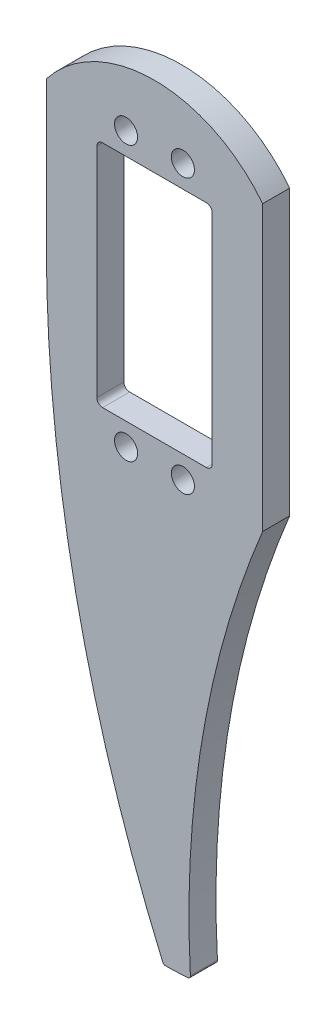
ISO-10303-21;
HEADER;
FILE_DESCRIPTION(('STEP AP214'),'2;1');
FILE_NAME('part.step','',(''),(''),'','','');
FILE_SCHEMA(('AUTOMOTIVE_DESIGN { 1 0 10303 214 1 1 1 1 }'));
ENDSEC;
DATA;
#1=APPLICATION_CONTEXT('core data for automotive mechanical design processes');
#2=APPLICATION_PROTOCOL_DEFINITION('international standard','automotive_design',2000,#1);
#3=PRODUCT_CONTEXT('',#1,'mechanical');
#4=PRODUCT('Part','Part','',(#3));
#5=PRODUCT_RELATED_PRODUCT_CATEGORY('part','',(#4));
#6=PRODUCT_DEFINITION_FORMATION('','',#4);
#7=PRODUCT_DEFINITION_CONTEXT('part definition',#1,'design');
#8=PRODUCT_DEFINITION('design','',#6,#7);
#9=PRODUCT_DEFINITION_SHAPE('','',#8);
#10=(LENGTH_UNIT() NAMED_UNIT(*) SI_UNIT(.MILLI.,.METRE.));
#11=(NAMED_UNIT(*) PLANE_ANGLE_UNIT() SI_UNIT($,.RADIAN.));
#12=(NAMED_UNIT(*) SI_UNIT($,.STERADIAN.) SOLID_ANGLE_UNIT());
#13=UNCERTAINTY_MEASURE_WITH_UNIT(LENGTH_MEASURE(1.E-05),#10,'distance_accuracy_value','');
#14=(GEOMETRIC_REPRESENTATION_CONTEXT(3) GLOBAL_UNCERTAINTY_ASSIGNED_CONTEXT((#13)) GLOBAL_UNIT_ASSIGNED_CONTEXT((#10,
#11,#12)) REPRESENTATION_CONTEXT('',''));
#15=CARTESIAN_POINT('',(0.,0.,0.));
#16=DIRECTION('',(0.,0.,1.));
#17=DIRECTION('',(1.,0.,0.));
#18=AXIS2_PLACEMENT_3D('',#15,#16,#17);
#19=CARTESIAN_POINT('',(-19.05,-14.8106178129071,4.7625));
#20=DIRECTION('',(0.,0.,1.));
#21=DIRECTION('',(1.,0.,0.));
#22=AXIS2_PLACEMENT_3D('',#19,#20,#21);
#23=PLANE('',#22);
#24=CARTESIAN_POINT('',(-24.0538,-49.1260178129071,4.7625));
#25=DIRECTION('',(0.,0.,1.));
#26=DIRECTION('',(1.,0.,0.));
#27=AXIS2_PLACEMENT_3D('',#24,#25,#26);
#28=CIRCLE('',#27,2.032);
#29=CARTESIAN_POINT('',(-26.0858,-49.1260178129071,4.7625));
#30=VERTEX_POINT('',#29);
#31=EDGE_CURVE('E298',#30,#30,#28,.T.);
#32=ORIENTED_EDGE('',*,*,#31,.F.);
#33=EDGE_LOOP('',(#32));
#34=FACE_BOUND('',#33,.T.);
#35=CARTESIAN_POINT('',(-14.0462,-0.866017812907058,4.7625));
#36=DIRECTION('',(0.,0.,1.));
#37=DIRECTION('',(1.,0.,0.));
#38=AXIS2_PLACEMENT_3D('',#35,#36,#37);
#39=CIRCLE('',#38,2.032);
#40=CARTESIAN_POINT('',(-16.0782,-0.866017812907058,4.7625));
#41=VERTEX_POINT('',#40);
#42=EDGE_CURVE('E280',#41,#41,#39,.T.);
#43=ORIENTED_EDGE('',*,*,#42,.F.);
#44=EDGE_LOOP('',(#43));
#45=FACE_BOUND('',#44,.T.);
#46=CARTESIAN_POINT('',(-19.05,-14.8106178129071,4.7625));
#47=DIRECTION('',(0.,0.,1.));
#48=DIRECTION('',(1.,0.,0.));
#49=AXIS2_PLACEMENT_3D('',#46,#47,#48);
#50=CIRCLE('',#49,110.);
#51=CARTESIAN_POINT('',(-17.1186626868823,-124.793661670508,4.7625));
#52=VERTEX_POINT('',#51);
#53=CARTESIAN_POINT('',(-13.2088056396765,-124.655419457978,4.7625));
#54=VERTEX_POINT('',#53);
#55=EDGE_CURVE('E229',#52,#54,#50,.T.);
#56=ORIENTED_EDGE('',*,*,#55,.T.);
#57=CARTESIAN_POINT('',(-13.2357813372678,-124.148136192199,4.7625));
#58=DIRECTION('',(0.,0.,1.));
#59=DIRECTION('',(1.,0.,0.));
#60=AXIS2_PLACEMENT_3D('',#57,#58,#59);
#61=CIRCLE('',#60,0.508);
#62=CARTESIAN_POINT('',(-12.7285425364788,-124.120336930084,4.7625));
#63=VERTEX_POINT('',#62);
#64=EDGE_CURVE('E41',#54,#63,#61,.T.);
#65=ORIENTED_EDGE('',*,*,#64,.T.);
#66=CARTESIAN_POINT('',(155.723912747509,-114.888286954809,4.7625));
#67=DIRECTION('',(0.,0.,-1.));
#68=DIRECTION('',(-1.,0.,0.));
#69=AXIS2_PLACEMENT_3D('',#66,#67,#68);
#70=CIRCLE('',#69,168.705247215224);
#71=CARTESIAN_POINT('',(0.,-49.9920356258141,4.7625));
#72=VERTEX_POINT('',#71);
#73=EDGE_CURVE('E227',#63,#72,#70,.T.);
#74=ORIENTED_EDGE('',*,*,#73,.T.);
#75=DIRECTION('',(0.,1.,0.));
#76=VECTOR('',#75,1.);
#77=CARTESIAN_POINT('',(0.,-49.9920356258141,4.7625));
#78=LINE('',#77,#76);
#79=CARTESIAN_POINT('',(0.,0.,4.7625));
#80=VERTEX_POINT('',#79);
#81=EDGE_CURVE('E163',#72,#80,#78,.T.);
#82=ORIENTED_EDGE('',*,*,#81,.T.);
#83=CARTESIAN_POINT('',(-19.05,-14.8106178129071,4.7625));
#84=DIRECTION('',(0.,0.,1.));
#85=DIRECTION('',(1.,0.,0.));
#86=AXIS2_PLACEMENT_3D('',#83,#84,#85);
#87=CIRCLE('',#86,24.13);
#88=CARTESIAN_POINT('',(-38.1,0.,4.7625));
#89=VERTEX_POINT('',#88);
#90=EDGE_CURVE('E158',#80,#89,#87,.T.);
#91=ORIENTED_EDGE('',*,*,#90,.T.);
#92=DIRECTION('',(0.,-1.,0.));
#93=VECTOR('',#92,1.);
#94=CARTESIAN_POINT('',(-38.1,0.,4.7625));
#95=LINE('',#94,#93);
#96=CARTESIAN_POINT('',(-38.1000000000001,-24.996017812907,4.7625));
#97=VERTEX_POINT('',#96);
#98=EDGE_CURVE('E148',#89,#97,#95,.T.);
#99=ORIENTED_EDGE('',*,*,#98,.T.);
#100=CARTESIAN_POINT('',(213.508258755887,-24.9960178129071,4.7625));
#101=DIRECTION('',(0.,0.,1.));
#102=DIRECTION('',(1.,0.,0.));
#103=AXIS2_PLACEMENT_3D('',#100,#101,#102);
#104=CIRCLE('',#103,251.608258755887);
#105=CARTESIAN_POINT('',(-17.5941804656756,-124.486612644848,4.7625));
#106=VERTEX_POINT('',#105);
#107=EDGE_CURVE('E157',#97,#106,#104,.T.);
#108=ORIENTED_EDGE('',*,*,#107,.T.);
#109=CARTESIAN_POINT('',(-17.1275819537465,-124.285739977056,4.7625));
#110=DIRECTION('',(0.,0.,1.));
#111=DIRECTION('',(1.,0.,0.));
#112=AXIS2_PLACEMENT_3D('',#109,#110,#111);
#113=CIRCLE('',#112,0.508);
#114=EDGE_CURVE('E224',#106,#52,#113,.T.);
#115=ORIENTED_EDGE('',*,*,#114,.T.);
#116=EDGE_LOOP('',(#56,#65,#74,#82,#91,#99,#108,#115));
#117=FACE_BOUND('',#116,.T.);
#118=DIRECTION('',(-1.,0.,0.));
#119=VECTOR('',#118,1.);
#120=CARTESIAN_POINT('',(-29.21,-4.80301781290706,4.7625));
#121=LINE('',#120,#119);
#122=CARTESIAN_POINT('',(-9.90600000000001,-4.80301781290706,4.7625));
#123=VERTEX_POINT('',#122);
#124=CARTESIAN_POINT('',(-28.194,-4.80301781290706,4.7625));
#125=VERTEX_POINT('',#124);
#126=EDGE_CURVE('E284',#123,#125,#121,.T.);
#127=ORIENTED_EDGE('',*,*,#126,.F.);
#128=CARTESIAN_POINT('',(-9.90600000000001,-5.81901781290706,4.7625));
#129=DIRECTION('',(0.,0.,1.));
#130=DIRECTION('',(1.,0.,0.));
#131=AXIS2_PLACEMENT_3D('',#128,#129,#130);
#132=CIRCLE('',#131,1.016);
#133=CARTESIAN_POINT('',(-8.89000000000001,-5.81901781290706,4.7625));
#134=VERTEX_POINT('',#133);
#135=EDGE_CURVE('E211',#123,#134,#132,.F.);
#136=ORIENTED_EDGE('',*,*,#135,.T.);
#137=DIRECTION('',(0.,1.,0.));
#138=VECTOR('',#137,1.);
#139=CARTESIAN_POINT('',(-8.89000000000001,-4.80301781290706,4.7625));
#140=LINE('',#139,#138);
#141=CARTESIAN_POINT('',(-8.89000000000001,-44.173017812907,4.7625));
#142=VERTEX_POINT('',#141);
#143=EDGE_CURVE('E271',#142,#134,#140,.T.);
#144=ORIENTED_EDGE('',*,*,#143,.F.);
#145=CARTESIAN_POINT('',(-9.90600000000001,-44.1730178129071,4.7625));
#146=DIRECTION('',(0.,0.,1.));
#147=DIRECTION('',(1.,0.,0.));
#148=AXIS2_PLACEMENT_3D('',#145,#146,#147);
#149=CIRCLE('',#148,1.016);
#150=CARTESIAN_POINT('',(-9.90600000000001,-45.1890178129071,4.7625));
#151=VERTEX_POINT('',#150);
#152=EDGE_CURVE('E203',#142,#151,#149,.F.);
#153=ORIENTED_EDGE('',*,*,#152,.T.);
#154=DIRECTION('',(1.,0.,0.));
#155=VECTOR('',#154,1.);
#156=CARTESIAN_POINT('',(-29.21,-45.1890178129071,4.7625));
#157=LINE('',#156,#155);
#158=CARTESIAN_POINT('',(-28.194,-45.1890178129071,4.7625));
#159=VERTEX_POINT('',#158);
#160=EDGE_CURVE('E259',#159,#151,#157,.T.);
#161=ORIENTED_EDGE('',*,*,#160,.F.);
#162=CARTESIAN_POINT('',(-28.194,-44.1730178129071,4.7625));
#163=DIRECTION('',(0.,0.,1.));
#164=DIRECTION('',(1.,0.,0.));
#165=AXIS2_PLACEMENT_3D('',#162,#163,#164);
#166=CIRCLE('',#165,1.016);
#167=CARTESIAN_POINT('',(-29.21,-44.173017812907,4.7625));
#168=VERTEX_POINT('',#167);
#169=EDGE_CURVE('E199',#159,#168,#166,.F.);
#170=ORIENTED_EDGE('',*,*,#169,.T.);
#171=DIRECTION('',(0.,-1.,0.));
#172=VECTOR('',#171,1.);
#173=CARTESIAN_POINT('',(-29.21,-4.80301781290706,4.7625));
#174=LINE('',#173,#172);
#175=CARTESIAN_POINT('',(-29.21,-5.81901781290706,4.7625));
#176=VERTEX_POINT('',#175);
#177=EDGE_CURVE('E262',#176,#168,#174,.T.);
#178=ORIENTED_EDGE('',*,*,#177,.F.);
#179=CARTESIAN_POINT('',(-28.194,-5.81901781290706,4.7625));
#180=DIRECTION('',(0.,0.,1.));
#181=DIRECTION('',(1.,0.,0.));
#182=AXIS2_PLACEMENT_3D('',#179,#180,#181);
#183=CIRCLE('',#182,1.016);
#184=EDGE_CURVE('E207',#176,#125,#183,.F.);
#185=ORIENTED_EDGE('',*,*,#184,.T.);
#186=EDGE_LOOP('',(#127,#136,#144,#153,#161,#170,#178,#185));
#187=FACE_BOUND('',#186,.T.);
#188=CARTESIAN_POINT('',(-24.0538,-0.866017812907058,4.7625));
#189=DIRECTION('',(0.,0.,1.));
#190=DIRECTION('',(-1.,0.,0.));
#191=AXIS2_PLACEMENT_3D('',#188,#189,#190);
#192=CIRCLE('',#191,2.032);
#193=CARTESIAN_POINT('',(-26.0858,-0.866017812907058,4.7625));
#194=VERTEX_POINT('',#193);
#195=EDGE_CURVE('E292',#194,#194,#192,.T.);
#196=ORIENTED_EDGE('',*,*,#195,.F.);
#197=EDGE_LOOP('',(#196));
#198=FACE_BOUND('',#197,.T.);
#199=CARTESIAN_POINT('',(-14.0462,-49.1260178129071,4.7625));
#200=DIRECTION('',(0.,0.,1.));
#201=DIRECTION('',(-1.,0.,0.));
#202=AXIS2_PLACEMENT_3D('',#199,#200,#201);
#203=CIRCLE('',#202,2.032);
#204=CARTESIAN_POINT('',(-16.0782,-49.1260178129071,4.7625));
#205=VERTEX_POINT('',#204);
#206=EDGE_CURVE('E304',#205,#205,#203,.T.);
#207=ORIENTED_EDGE('',*,*,#206,.F.);
#208=EDGE_LOOP('',(#207));
#209=FACE_BOUND('',#208,.T.);
#210=ADVANCED_FACE('F33',(#34,#45,#117,#187,#198,#209),#23,.T.);
#211=CARTESIAN_POINT('',(-19.05,-14.8106178129071,0.));
#212=DIRECTION('',(0.,0.,1.));
#213=DIRECTION('',(1.,0.,0.));
#214=AXIS2_PLACEMENT_3D('',#211,#212,#213);
#215=PLANE('',#214);
#216=CARTESIAN_POINT('',(-24.0538,-49.1260178129071,0.));
#217=DIRECTION('',(0.,0.,1.));
#218=DIRECTION('',(1.,0.,0.));
#219=AXIS2_PLACEMENT_3D('',#216,#217,#218);
#220=CIRCLE('',#219,2.032);
#221=CARTESIAN_POINT('',(-26.0858,-49.1260178129071,0.));
#222=VERTEX_POINT('',#221);
#223=EDGE_CURVE('E301',#222,#222,#220,.T.);
#224=ORIENTED_EDGE('',*,*,#223,.T.);
#225=EDGE_LOOP('',(#224));
#226=FACE_BOUND('',#225,.T.);
#227=CARTESIAN_POINT('',(-14.0462,-0.866017812907058,0.));
#228=DIRECTION('',(0.,0.,1.));
#229=DIRECTION('',(1.,0.,0.));
#230=AXIS2_PLACEMENT_3D('',#227,#228,#229);
#231=CIRCLE('',#230,2.032);
#232=CARTESIAN_POINT('',(-16.0782,-0.866017812907058,0.));
#233=VERTEX_POINT('',#232);
#234=EDGE_CURVE('E289',#233,#233,#231,.T.);
#235=ORIENTED_EDGE('',*,*,#234,.T.);
#236=EDGE_LOOP('',(#235));
#237=FACE_BOUND('',#236,.T.);
#238=CARTESIAN_POINT('',(155.723912747509,-114.888286954809,0.));
#239=DIRECTION('',(0.,0.,-1.));
#240=DIRECTION('',(-1.,0.,0.));
#241=AXIS2_PLACEMENT_3D('',#238,#239,#240);
#242=CIRCLE('',#241,168.705247215224);
#243=CARTESIAN_POINT('',(-12.7285425364788,-124.120336930084,0.));
#244=VERTEX_POINT('',#243);
#245=CARTESIAN_POINT('',(0.,-49.9920356258141,0.));
#246=VERTEX_POINT('',#245);
#247=EDGE_CURVE('E244',#244,#246,#242,.T.);
#248=ORIENTED_EDGE('',*,*,#247,.F.);
#249=CARTESIAN_POINT('',(-13.2357813372678,-124.148136192199,0.));
#250=DIRECTION('',(0.,0.,1.));
#251=DIRECTION('',(1.,0.,0.));
#252=AXIS2_PLACEMENT_3D('',#249,#250,#251);
#253=CIRCLE('',#252,0.508);
#254=CARTESIAN_POINT('',(-13.2088056396765,-124.655419457978,0.));
#255=VERTEX_POINT('',#254);
#256=EDGE_CURVE('E218',#244,#255,#253,.F.);
#257=ORIENTED_EDGE('',*,*,#256,.T.);
#258=CARTESIAN_POINT('',(-19.05,-14.8106178129071,0.));
#259=DIRECTION('',(0.,0.,1.));
#260=DIRECTION('',(1.,0.,0.));
#261=AXIS2_PLACEMENT_3D('',#258,#259,#260);
#262=CIRCLE('',#261,110.);
#263=CARTESIAN_POINT('',(-17.1186626868823,-124.793661670508,0.));
#264=VERTEX_POINT('',#263);
#265=EDGE_CURVE('E242',#264,#255,#262,.T.);
#266=ORIENTED_EDGE('',*,*,#265,.F.);
#267=CARTESIAN_POINT('',(-17.1275819537465,-124.285739977056,0.));
#268=DIRECTION('',(0.,0.,1.));
#269=DIRECTION('',(1.,0.,0.));
#270=AXIS2_PLACEMENT_3D('',#267,#268,#269);
#271=CIRCLE('',#270,0.508);
#272=CARTESIAN_POINT('',(-17.5941804656756,-124.486612644848,0.));
#273=VERTEX_POINT('',#272);
#274=EDGE_CURVE('E216',#264,#273,#271,.F.);
#275=ORIENTED_EDGE('',*,*,#274,.T.);
#276=CARTESIAN_POINT('',(213.508258755887,-24.9960178129071,0.));
#277=DIRECTION('',(0.,0.,1.));
#278=DIRECTION('',(1.,0.,0.));
#279=AXIS2_PLACEMENT_3D('',#276,#277,#278);
#280=CIRCLE('',#279,251.608258755887);
#281=CARTESIAN_POINT('',(-38.1000000000001,-24.996017812907,0.));
#282=VERTEX_POINT('',#281);
#283=EDGE_CURVE('E247',#282,#273,#280,.T.);
#284=ORIENTED_EDGE('',*,*,#283,.F.);
#285=DIRECTION('',(0.,-1.,0.));
#286=VECTOR('',#285,1.);
#287=CARTESIAN_POINT('',(-38.1,0.,0.));
#288=LINE('',#287,#286);
#289=CARTESIAN_POINT('',(-38.1,0.,0.));
#290=VERTEX_POINT('',#289);
#291=EDGE_CURVE('E250',#290,#282,#288,.T.);
#292=ORIENTED_EDGE('',*,*,#291,.F.);
#293=CARTESIAN_POINT('',(-19.05,-14.8106178129071,0.));
#294=DIRECTION('',(0.,0.,1.));
#295=DIRECTION('',(1.,0.,0.));
#296=AXIS2_PLACEMENT_3D('',#293,#294,#295);
#297=CIRCLE('',#296,24.13);
#298=CARTESIAN_POINT('',(0.,0.,0.));
#299=VERTEX_POINT('',#298);
#300=EDGE_CURVE('E171',#299,#290,#297,.T.);
#301=ORIENTED_EDGE('',*,*,#300,.F.);
#302=DIRECTION('',(0.,1.,0.));
#303=VECTOR('',#302,1.);
#304=CARTESIAN_POINT('',(0.,-49.9920356258141,0.));
#305=LINE('',#304,#303);
#306=EDGE_CURVE('E167',#246,#299,#305,.T.);
#307=ORIENTED_EDGE('',*,*,#306,.F.);
#308=EDGE_LOOP('',(#248,#257,#266,#275,#284,#292,#301,#307));
#309=FACE_BOUND('',#308,.T.);
#310=DIRECTION('',(1.,0.,0.));
#311=VECTOR('',#310,1.);
#312=CARTESIAN_POINT('',(-29.21,-45.1890178129071,0.));
#313=LINE('',#312,#311);
#314=CARTESIAN_POINT('',(-28.194,-45.1890178129071,0.));
#315=VERTEX_POINT('',#314);
#316=CARTESIAN_POINT('',(-9.90600000000001,-45.1890178129071,0.));
#317=VERTEX_POINT('',#316);
#318=EDGE_CURVE('E268',#315,#317,#313,.T.);
#319=ORIENTED_EDGE('',*,*,#318,.T.);
#320=CARTESIAN_POINT('',(-9.90600000000001,-44.1730178129071,0.));
#321=DIRECTION('',(0.,0.,1.));
#322=DIRECTION('',(1.,0.,0.));
#323=AXIS2_PLACEMENT_3D('',#320,#321,#322);
#324=CIRCLE('',#323,1.016);
#325=CARTESIAN_POINT('',(-8.89000000000001,-44.173017812907,0.));
#326=VERTEX_POINT('',#325);
#327=EDGE_CURVE('E201',#317,#326,#324,.T.);
#328=ORIENTED_EDGE('',*,*,#327,.T.);
#329=DIRECTION('',(0.,1.,0.));
#330=VECTOR('',#329,1.);
#331=CARTESIAN_POINT('',(-8.89000000000001,-4.80301781290706,0.));
#332=LINE('',#331,#330);
#333=CARTESIAN_POINT('',(-8.89000000000001,-5.81901781290706,0.));
#334=VERTEX_POINT('',#333);
#335=EDGE_CURVE('E278',#326,#334,#332,.T.);
#336=ORIENTED_EDGE('',*,*,#335,.T.);
#337=CARTESIAN_POINT('',(-9.90600000000001,-5.81901781290706,0.));
#338=DIRECTION('',(0.,0.,1.));
#339=DIRECTION('',(1.,0.,0.));
#340=AXIS2_PLACEMENT_3D('',#337,#338,#339);
#341=CIRCLE('',#340,1.016);
#342=CARTESIAN_POINT('',(-9.90600000000001,-4.80301781290706,0.));
#343=VERTEX_POINT('',#342);
#344=EDGE_CURVE('E209',#334,#343,#341,.T.);
#345=ORIENTED_EDGE('',*,*,#344,.T.);
#346=DIRECTION('',(-1.,0.,0.));
#347=VECTOR('',#346,1.);
#348=CARTESIAN_POINT('',(-29.21,-4.80301781290706,0.));
#349=LINE('',#348,#347);
#350=CARTESIAN_POINT('',(-28.194,-4.80301781290706,0.));
#351=VERTEX_POINT('',#350);
#352=EDGE_CURVE('E275',#343,#351,#349,.T.);
#353=ORIENTED_EDGE('',*,*,#352,.T.);
#354=CARTESIAN_POINT('',(-28.194,-5.81901781290706,0.));
#355=DIRECTION('',(0.,0.,1.));
#356=DIRECTION('',(1.,0.,0.));
#357=AXIS2_PLACEMENT_3D('',#354,#355,#356);
#358=CIRCLE('',#357,1.016);
#359=CARTESIAN_POINT('',(-29.21,-5.81901781290706,0.));
#360=VERTEX_POINT('',#359);
#361=EDGE_CURVE('E205',#351,#360,#358,.T.);
#362=ORIENTED_EDGE('',*,*,#361,.T.);
#363=DIRECTION('',(0.,-1.,0.));
#364=VECTOR('',#363,1.);
#365=CARTESIAN_POINT('',(-29.21,-4.80301781290706,0.));
#366=LINE('',#365,#364);
#367=CARTESIAN_POINT('',(-29.21,-44.173017812907,0.));
#368=VERTEX_POINT('',#367);
#369=EDGE_CURVE('E272',#360,#368,#366,.T.);
#370=ORIENTED_EDGE('',*,*,#369,.T.);
#371=CARTESIAN_POINT('',(-28.194,-44.1730178129071,0.));
#372=DIRECTION('',(0.,0.,1.));
#373=DIRECTION('',(1.,0.,0.));
#374=AXIS2_PLACEMENT_3D('',#371,#372,#373);
#375=CIRCLE('',#374,1.016);
#376=EDGE_CURVE('E197',#368,#315,#375,.T.);
#377=ORIENTED_EDGE('',*,*,#376,.T.);
#378=EDGE_LOOP('',(#319,#328,#336,#345,#353,#362,#370,#377));
#379=FACE_BOUND('',#378,.T.);
#380=CARTESIAN_POINT('',(-24.0538,-0.866017812907058,0.));
#381=DIRECTION('',(0.,0.,1.));
#382=DIRECTION('',(-1.,0.,0.));
#383=AXIS2_PLACEMENT_3D('',#380,#381,#382);
#384=CIRCLE('',#383,2.032);
#385=CARTESIAN_POINT('',(-26.0858,-0.866017812907058,0.));
#386=VERTEX_POINT('',#385);
#387=EDGE_CURVE('E295',#386,#386,#384,.T.);
#388=ORIENTED_EDGE('',*,*,#387,.T.);
#389=EDGE_LOOP('',(#388));
#390=FACE_BOUND('',#389,.T.);
#391=CARTESIAN_POINT('',(-14.0462,-49.1260178129071,0.));
#392=DIRECTION('',(0.,0.,1.));
#393=DIRECTION('',(-1.,0.,0.));
#394=AXIS2_PLACEMENT_3D('',#391,#392,#393);
#395=CIRCLE('',#394,2.032);
#396=CARTESIAN_POINT('',(-16.0782,-49.1260178129071,0.));
#397=VERTEX_POINT('',#396);
#398=EDGE_CURVE('E307',#397,#397,#395,.T.);
#399=ORIENTED_EDGE('',*,*,#398,.T.);
#400=EDGE_LOOP('',(#399));
#401=FACE_BOUND('',#400,.T.);
#402=ADVANCED_FACE('F240',(#226,#237,#309,#379,#390,#401),#215,.F.);
#403=CARTESIAN_POINT('',(-19.05,-14.8106178129071,4.7625));
#404=DIRECTION('',(0.,0.,-1.));
#405=DIRECTION('',(-1.,0.,0.));
#406=AXIS2_PLACEMENT_3D('',#403,#404,#405);
#407=CYLINDRICAL_SURFACE('',#406,24.13);
#408=ORIENTED_EDGE('',*,*,#300,.T.);
#409=DIRECTION('',(0.,0.,-1.));
#410=VECTOR('',#409,1.);
#411=CARTESIAN_POINT('',(-38.1,0.,4.7625));
#412=LINE('',#411,#410);
#413=EDGE_CURVE('E152',#89,#290,#412,.T.);
#414=ORIENTED_EDGE('',*,*,#413,.F.);
#415=ORIENTED_EDGE('',*,*,#90,.F.);
#416=DIRECTION('',(0.,0.,-1.));
#417=VECTOR('',#416,1.);
#418=CARTESIAN_POINT('',(0.,0.,4.7625));
#419=LINE('',#418,#417);
#420=EDGE_CURVE('E255',#80,#299,#419,.T.);
#421=ORIENTED_EDGE('',*,*,#420,.T.);
#422=EDGE_LOOP('',(#408,#414,#415,#421));
#423=FACE_BOUND('',#422,.T.);
#424=ADVANCED_FACE('F169',(#423),#407,.T.);
#425=CARTESIAN_POINT('',(-38.1,0.,4.7625));
#426=DIRECTION('',(1.,0.,0.));
#427=DIRECTION('',(0.,1.,0.));
#428=AXIS2_PLACEMENT_3D('',#425,#426,#427);
#429=PLANE('',#428);
#430=ORIENTED_EDGE('',*,*,#291,.T.);
#431=DIRECTION('',(0.,0.,-1.));
#432=VECTOR('',#431,1.);
#433=CARTESIAN_POINT('',(-38.1000000000001,-24.996017812907,4.7625));
#434=LINE('',#433,#432);
#435=EDGE_CURVE('E155',#97,#282,#434,.T.);
#436=ORIENTED_EDGE('',*,*,#435,.F.);
#437=ORIENTED_EDGE('',*,*,#98,.F.);
#438=ORIENTED_EDGE('',*,*,#413,.T.);
#439=EDGE_LOOP('',(#430,#436,#437,#438));
#440=FACE_BOUND('',#439,.T.);
#441=ADVANCED_FACE('F150',(#440),#429,.F.);
#442=CARTESIAN_POINT('',(213.508258755887,-24.9960178129071,4.7625));
#443=DIRECTION('',(0.,0.,-1.));
#444=DIRECTION('',(-1.,0.,0.));
#445=AXIS2_PLACEMENT_3D('',#442,#443,#444);
#446=CYLINDRICAL_SURFACE('',#445,251.608258755887);
#447=ORIENTED_EDGE('',*,*,#283,.T.);
#448=DIRECTION('',(0.,0.,-1.));
#449=VECTOR('',#448,1.);
#450=CARTESIAN_POINT('',(-17.5941804656756,-124.486612644848,4.7625));
#451=LINE('',#450,#449);
#452=EDGE_CURVE('E11',#273,#106,#451,.F.);
#453=ORIENTED_EDGE('',*,*,#452,.T.);
#454=ORIENTED_EDGE('',*,*,#107,.F.);
#455=ORIENTED_EDGE('',*,*,#435,.T.);
#456=EDGE_LOOP('',(#447,#453,#454,#455));
#457=FACE_BOUND('',#456,.T.);
#458=ADVANCED_FACE('F336',(#457),#446,.T.);
#459=CARTESIAN_POINT('',(-19.05,-14.8106178129071,4.7625));
#460=DIRECTION('',(0.,0.,-1.));
#461=DIRECTION('',(-1.,0.,0.));
#462=AXIS2_PLACEMENT_3D('',#459,#460,#461);
#463=CYLINDRICAL_SURFACE('',#462,110.);
#464=ORIENTED_EDGE('',*,*,#265,.T.);
#465=DIRECTION('',(0.,0.,-1.));
#466=VECTOR('',#465,1.);
#467=CARTESIAN_POINT('',(-13.2088056396765,-124.655419457978,4.7625));
#468=LINE('',#467,#466);
#469=EDGE_CURVE('E54',#255,#54,#468,.F.);
#470=ORIENTED_EDGE('',*,*,#469,.T.);
#471=ORIENTED_EDGE('',*,*,#55,.F.);
#472=DIRECTION('',(0.,0.,-1.));
#473=VECTOR('',#472,1.);
#474=CARTESIAN_POINT('',(-17.1186626868823,-124.793661670508,4.7625));
#475=LINE('',#474,#473);
#476=EDGE_CURVE('E220',#52,#264,#475,.T.);
#477=ORIENTED_EDGE('',*,*,#476,.T.);
#478=EDGE_LOOP('',(#464,#470,#471,#477));
#479=FACE_BOUND('',#478,.T.);
#480=ADVANCED_FACE('F245',(#479),#463,.T.);
#481=CARTESIAN_POINT('',(155.723912747509,-114.888286954809,4.7625));
#482=DIRECTION('',(0.,0.,-1.));
#483=DIRECTION('',(-1.,0.,0.));
#484=AXIS2_PLACEMENT_3D('',#481,#482,#483);
#485=CYLINDRICAL_SURFACE('',#484,168.705247215224);
#486=ORIENTED_EDGE('',*,*,#73,.F.);
#487=DIRECTION('',(0.,0.,-1.));
#488=VECTOR('',#487,1.);
#489=CARTESIAN_POINT('',(-12.7285425364788,-124.120336930084,4.7625));
#490=LINE('',#489,#488);
#491=EDGE_CURVE('E213',#63,#244,#490,.T.);
#492=ORIENTED_EDGE('',*,*,#491,.T.);
#493=ORIENTED_EDGE('',*,*,#247,.T.);
#494=DIRECTION('',(0.,0.,-1.));
#495=VECTOR('',#494,1.);
#496=CARTESIAN_POINT('',(0.,-49.9920356258141,4.7625));
#497=LINE('',#496,#495);
#498=EDGE_CURVE('E176',#72,#246,#497,.T.);
#499=ORIENTED_EDGE('',*,*,#498,.F.);
#500=EDGE_LOOP('',(#486,#492,#493,#499));
#501=FACE_BOUND('',#500,.T.);
#502=ADVANCED_FACE('F233',(#501),#485,.F.);
#503=CARTESIAN_POINT('',(0.,-49.9920356258141,4.7625));
#504=DIRECTION('',(-1.,0.,0.));
#505=DIRECTION('',(0.,-1.,0.));
#506=AXIS2_PLACEMENT_3D('',#503,#504,#505);
#507=PLANE('',#506);
#508=ORIENTED_EDGE('',*,*,#306,.T.);
#509=ORIENTED_EDGE('',*,*,#420,.F.);
#510=ORIENTED_EDGE('',*,*,#81,.F.);
#511=ORIENTED_EDGE('',*,*,#498,.T.);
#512=EDGE_LOOP('',(#508,#509,#510,#511));
#513=FACE_BOUND('',#512,.T.);
#514=ADVANCED_FACE('F257',(#513),#507,.F.);
#515=CARTESIAN_POINT('',(-8.89000000000001,-4.80301781290706,4.7625));
#516=DIRECTION('',(-1.,0.,0.));
#517=DIRECTION('',(0.,0.,1.));
#518=AXIS2_PLACEMENT_3D('',#515,#516,#517);
#519=PLANE('',#518);
#520=ORIENTED_EDGE('',*,*,#335,.F.);
#521=DIRECTION('',(0.,0.,-1.));
#522=VECTOR('',#521,1.);
#523=CARTESIAN_POINT('',(-8.89000000000001,-44.1730178129071,4.7625));
#524=LINE('',#523,#522);
#525=EDGE_CURVE('E190',#326,#142,#524,.F.);
#526=ORIENTED_EDGE('',*,*,#525,.T.);
#527=ORIENTED_EDGE('',*,*,#143,.T.);
#528=DIRECTION('',(0.,0.,-1.));
#529=VECTOR('',#528,1.);
#530=CARTESIAN_POINT('',(-8.89000000000001,-5.81901781290706,0.));
#531=LINE('',#530,#529);
#532=EDGE_CURVE('E187',#134,#334,#531,.T.);
#533=ORIENTED_EDGE('',*,*,#532,.T.);
#534=EDGE_LOOP('',(#520,#526,#527,#533));
#535=FACE_BOUND('',#534,.T.);
#536=ADVANCED_FACE('F327',(#535),#519,.T.);
#537=CARTESIAN_POINT('',(-29.21,-4.80301781290706,4.7625));
#538=DIRECTION('',(0.,-1.,0.));
#539=DIRECTION('',(0.,0.,-1.));
#540=AXIS2_PLACEMENT_3D('',#537,#538,#539);
#541=PLANE('',#540);
#542=ORIENTED_EDGE('',*,*,#126,.T.);
#543=DIRECTION('',(0.,0.,-1.));
#544=VECTOR('',#543,1.);
#545=CARTESIAN_POINT('',(-28.194,-4.80301781290706,0.));
#546=LINE('',#545,#544);
#547=EDGE_CURVE('E194',#125,#351,#546,.T.);
#548=ORIENTED_EDGE('',*,*,#547,.T.);
#549=ORIENTED_EDGE('',*,*,#352,.F.);
#550=DIRECTION('',(0.,0.,-1.));
#551=VECTOR('',#550,1.);
#552=CARTESIAN_POINT('',(-9.90600000000001,-4.80301781290706,4.7625));
#553=LINE('',#552,#551);
#554=EDGE_CURVE('E192',#343,#123,#553,.F.);
#555=ORIENTED_EDGE('',*,*,#554,.T.);
#556=EDGE_LOOP('',(#542,#548,#549,#555));
#557=FACE_BOUND('',#556,.T.);
#558=ADVANCED_FACE('F450',(#557),#541,.T.);
#559=CARTESIAN_POINT('',(-29.21,-4.80301781290706,4.7625));
#560=DIRECTION('',(1.,0.,0.));
#561=DIRECTION('',(0.,0.,-1.));
#562=AXIS2_PLACEMENT_3D('',#559,#560,#561);
#563=PLANE('',#562);
#564=ORIENTED_EDGE('',*,*,#177,.T.);
#565=DIRECTION('',(0.,0.,-1.));
#566=VECTOR('',#565,1.);
#567=CARTESIAN_POINT('',(-29.21,-44.1730178129071,0.));
#568=LINE('',#567,#566);
#569=EDGE_CURVE('E174',#168,#368,#568,.T.);
#570=ORIENTED_EDGE('',*,*,#569,.T.);
#571=ORIENTED_EDGE('',*,*,#369,.F.);
#572=DIRECTION('',(0.,0.,-1.));
#573=VECTOR('',#572,1.);
#574=CARTESIAN_POINT('',(-29.21,-5.81901781290706,4.7625));
#575=LINE('',#574,#573);
#576=EDGE_CURVE('E172',#360,#176,#575,.F.);
#577=ORIENTED_EDGE('',*,*,#576,.T.);
#578=EDGE_LOOP('',(#564,#570,#571,#577));
#579=FACE_BOUND('',#578,.T.);
#580=ADVANCED_FACE('F438',(#579),#563,.T.);
#581=CARTESIAN_POINT('',(-29.21,-45.1890178129071,4.7625));
#582=DIRECTION('',(0.,1.,0.));
#583=DIRECTION('',(0.,0.,1.));
#584=AXIS2_PLACEMENT_3D('',#581,#582,#583);
#585=PLANE('',#584);
#586=ORIENTED_EDGE('',*,*,#318,.F.);
#587=DIRECTION('',(0.,0.,-1.));
#588=VECTOR('',#587,1.);
#589=CARTESIAN_POINT('',(-28.194,-45.1890178129071,4.7625));
#590=LINE('',#589,#588);
#591=EDGE_CURVE('E185',#315,#159,#590,.F.);
#592=ORIENTED_EDGE('',*,*,#591,.T.);
#593=ORIENTED_EDGE('',*,*,#160,.T.);
#594=DIRECTION('',(0.,0.,-1.));
#595=VECTOR('',#594,1.);
#596=CARTESIAN_POINT('',(-9.90600000000001,-45.1890178129071,0.));
#597=LINE('',#596,#595);
#598=EDGE_CURVE('E182',#151,#317,#597,.T.);
#599=ORIENTED_EDGE('',*,*,#598,.T.);
#600=EDGE_LOOP('',(#586,#592,#593,#599));
#601=FACE_BOUND('',#600,.T.);
#602=ADVANCED_FACE('F432',(#601),#585,.T.);
#603=CARTESIAN_POINT('',(-14.0462,-0.866017812907058,4.7625));
#604=DIRECTION('',(0.,0.,-1.));
#605=DIRECTION('',(-1.,0.,0.));
#606=AXIS2_PLACEMENT_3D('',#603,#604,#605);
#607=CYLINDRICAL_SURFACE('',#606,2.032);
#608=CARTESIAN_POINT('',(-16.0782,-0.866017812907058,4.7625));
#609=CARTESIAN_POINT('',(-16.0782,-0.866017812907058,4.712890625));
#610=CARTESIAN_POINT('',(-16.0782,-0.866017812907058,4.66328125));
#611=CARTESIAN_POINT('',(-16.0782,-0.866017812907058,4.5640625));
#612=CARTESIAN_POINT('',(-16.0782,-0.866017812907058,4.514453125));
#613=CARTESIAN_POINT('',(-16.0782,-0.866017812907058,4.415234375));
#614=CARTESIAN_POINT('',(-16.0782,-0.866017812907058,4.365625));
#615=CARTESIAN_POINT('',(-16.0782,-0.866017812907058,4.26640625));
#616=CARTESIAN_POINT('',(-16.0782,-0.866017812907058,4.216796875));
#617=CARTESIAN_POINT('',(-16.0782,-0.866017812907058,4.117578125));
#618=CARTESIAN_POINT('',(-16.0782,-0.866017812907058,4.06796875));
#619=CARTESIAN_POINT('',(-16.0782,-0.866017812907058,3.96875));
#620=CARTESIAN_POINT('',(-16.0782,-0.866017812907058,3.919140625));
#621=CARTESIAN_POINT('',(-16.0782,-0.866017812907058,3.819921875));
#622=CARTESIAN_POINT('',(-16.0782,-0.866017812907058,3.7703125));
#623=CARTESIAN_POINT('',(-16.0782,-0.866017812907058,3.67109375));
#624=CARTESIAN_POINT('',(-16.0782,-0.866017812907058,3.621484375));
#625=CARTESIAN_POINT('',(-16.0782,-0.866017812907058,3.522265625));
#626=CARTESIAN_POINT('',(-16.0782,-0.866017812907058,3.47265625));
#627=CARTESIAN_POINT('',(-16.0782,-0.866017812907058,3.3734375));
#628=CARTESIAN_POINT('',(-16.0782,-0.866017812907058,3.323828125));
#629=CARTESIAN_POINT('',(-16.0782,-0.866017812907058,3.224609375));
#630=CARTESIAN_POINT('',(-16.0782,-0.866017812907058,3.175));
#631=CARTESIAN_POINT('',(-16.0782,-0.866017812907058,3.07578125));
#632=CARTESIAN_POINT('',(-16.0782,-0.866017812907058,3.026171875));
#633=CARTESIAN_POINT('',(-16.0782,-0.866017812907058,2.926953125));
#634=CARTESIAN_POINT('',(-16.0782,-0.866017812907058,2.87734375));
#635=CARTESIAN_POINT('',(-16.0782,-0.866017812907058,2.778125));
#636=CARTESIAN_POINT('',(-16.0782,-0.866017812907058,2.728515625));
#637=CARTESIAN_POINT('',(-16.0782,-0.866017812907058,2.629296875));
#638=CARTESIAN_POINT('',(-16.0782,-0.866017812907058,2.5796875));
#639=CARTESIAN_POINT('',(-16.0782,-0.866017812907058,2.48046875));
#640=CARTESIAN_POINT('',(-16.0782,-0.866017812907058,2.430859375));
#641=CARTESIAN_POINT('',(-16.0782,-0.866017812907058,2.331640625));
#642=CARTESIAN_POINT('',(-16.0782,-0.866017812907058,2.28203125));
#643=CARTESIAN_POINT('',(-16.0782,-0.866017812907058,2.1828125));
#644=CARTESIAN_POINT('',(-16.0782,-0.866017812907058,2.133203125));
#645=CARTESIAN_POINT('',(-16.0782,-0.866017812907058,2.033984375));
#646=CARTESIAN_POINT('',(-16.0782,-0.866017812907058,1.984375));
#647=CARTESIAN_POINT('',(-16.0782,-0.866017812907058,1.88515625));
#648=CARTESIAN_POINT('',(-16.0782,-0.866017812907058,1.835546875));
#649=CARTESIAN_POINT('',(-16.0782,-0.866017812907058,1.736328125));
#650=CARTESIAN_POINT('',(-16.0782,-0.866017812907058,1.68671875));
#651=CARTESIAN_POINT('',(-16.0782,-0.866017812907058,1.5875));
#652=CARTESIAN_POINT('',(-16.0782,-0.866017812907058,1.537890625));
#653=CARTESIAN_POINT('',(-16.0782,-0.866017812907058,1.438671875));
#654=CARTESIAN_POINT('',(-16.0782,-0.866017812907058,1.3890625));
#655=CARTESIAN_POINT('',(-16.0782,-0.866017812907058,1.28984375));
#656=CARTESIAN_POINT('',(-16.0782,-0.866017812907058,1.240234375));
#657=CARTESIAN_POINT('',(-16.0782,-0.866017812907058,1.141015625));
#658=CARTESIAN_POINT('',(-16.0782,-0.866017812907058,1.09140625));
#659=CARTESIAN_POINT('',(-16.0782,-0.866017812907058,0.992187499999999));
#660=CARTESIAN_POINT('',(-16.0782,-0.866017812907058,0.942578124999999));
#661=CARTESIAN_POINT('',(-16.0782,-0.866017812907058,0.843359375));
#662=CARTESIAN_POINT('',(-16.0782,-0.866017812907058,0.79375));
#663=CARTESIAN_POINT('',(-16.0782,-0.866017812907058,0.69453125));
#664=CARTESIAN_POINT('',(-16.0782,-0.866017812907058,0.644921875));
#665=CARTESIAN_POINT('',(-16.0782,-0.866017812907058,0.545703125));
#666=CARTESIAN_POINT('',(-16.0782,-0.866017812907058,0.49609375));
#667=CARTESIAN_POINT('',(-16.0782,-0.866017812907058,0.396875));
#668=CARTESIAN_POINT('',(-16.0782,-0.866017812907058,0.347265625));
#669=CARTESIAN_POINT('',(-16.0782,-0.866017812907058,0.248046875));
#670=CARTESIAN_POINT('',(-16.0782,-0.866017812907058,0.1984375));
#671=CARTESIAN_POINT('',(-16.0782,-0.866017812907058,0.09921875));
#672=CARTESIAN_POINT('',(-16.0782,-0.866017812907058,0.049609375));
#673=CARTESIAN_POINT('',(-16.0782,-0.866017812907058,0.));
#674=B_SPLINE_CURVE_WITH_KNOTS('',3,(#608,#609,#610,#611,#612,#613,#614,#615,#616,#617,#618,
#619,#620,#621,#622,#623,#624,#625,#626,#627,#628,#629,#630,#631,#632,#633,#634,#635,#636,#637,
#638,#639,#640,#641,#642,#643,#644,#645,#646,#647,#648,#649,#650,#651,#652,#653,#654,#655,#656,
#657,#658,#659,#660,#661,#662,#663,#664,#665,#666,#667,#668,#669,#670,#671,#672,#673),
.UNSPECIFIED.,.F.,.F.,(4,2,2,2,2,2,2,2,2,2,2,2,2,2,2,2,2,2,2,2,2,2,2,2,2,2,2,2,2,2,2,2,4),(0.,
0.148828125,0.29765625,0.446484375,0.5953125,0.744140625,0.892968750000001,1.041796875,1.190625,
1.339453125,1.48828125,1.637109375,1.7859375,1.934765625,2.08359375,2.232421875,2.38125,
2.530078125,2.67890625,2.827734375,2.9765625,3.125390625,3.27421875,3.423046875,3.571875,
3.720703125,3.86953125,4.018359375,4.1671875,4.316015625,4.46484375,4.613671875,4.7625),.UNSPECIFIED.);
#675=EDGE_CURVE('BSEAM437',#41,#233,#674,.T.);
#676=ORIENTED_EDGE('',*,*,#42,.T.);
#677=ORIENTED_EDGE('',*,*,#234,.F.);
#678=ORIENTED_EDGE('',*,*,#675,.T.);
#679=ORIENTED_EDGE('',*,*,#675,.F.);
#680=EDGE_LOOP('',(#676,#678,#677,#679));
#681=FACE_BOUND('',#680,.T.);
#682=ADVANCED_FACE('F437',(#681),#607,.F.);
#683=CARTESIAN_POINT('',(-24.0538,-0.866017812907058,4.7625));
#684=DIRECTION('',(0.,0.,-1.));
#685=DIRECTION('',(-1.,0.,0.));
#686=AXIS2_PLACEMENT_3D('',#683,#684,#685);
#687=CYLINDRICAL_SURFACE('',#686,2.032);
#688=CARTESIAN_POINT('',(-26.0858,-0.866017812907058,4.7625));
#689=CARTESIAN_POINT('',(-26.0858,-0.866017812907058,4.712890625));
#690=CARTESIAN_POINT('',(-26.0858,-0.866017812907058,4.66328125));
#691=CARTESIAN_POINT('',(-26.0858,-0.866017812907058,4.5640625));
#692=CARTESIAN_POINT('',(-26.0858,-0.866017812907058,4.514453125));
#693=CARTESIAN_POINT('',(-26.0858,-0.866017812907058,4.415234375));
#694=CARTESIAN_POINT('',(-26.0858,-0.866017812907058,4.365625));
#695=CARTESIAN_POINT('',(-26.0858,-0.866017812907058,4.26640625));
#696=CARTESIAN_POINT('',(-26.0858,-0.866017812907058,4.216796875));
#697=CARTESIAN_POINT('',(-26.0858,-0.866017812907058,4.117578125));
#698=CARTESIAN_POINT('',(-26.0858,-0.866017812907058,4.06796875));
#699=CARTESIAN_POINT('',(-26.0858,-0.866017812907058,3.96875));
#700=CARTESIAN_POINT('',(-26.0858,-0.866017812907058,3.919140625));
#701=CARTESIAN_POINT('',(-26.0858,-0.866017812907058,3.819921875));
#702=CARTESIAN_POINT('',(-26.0858,-0.866017812907058,3.7703125));
#703=CARTESIAN_POINT('',(-26.0858,-0.866017812907058,3.67109375));
#704=CARTESIAN_POINT('',(-26.0858,-0.866017812907058,3.621484375));
#705=CARTESIAN_POINT('',(-26.0858,-0.866017812907058,3.522265625));
#706=CARTESIAN_POINT('',(-26.0858,-0.866017812907058,3.47265625));
#707=CARTESIAN_POINT('',(-26.0858,-0.866017812907058,3.3734375));
#708=CARTESIAN_POINT('',(-26.0858,-0.866017812907058,3.323828125));
#709=CARTESIAN_POINT('',(-26.0858,-0.866017812907058,3.224609375));
#710=CARTESIAN_POINT('',(-26.0858,-0.866017812907058,3.175));
#711=CARTESIAN_POINT('',(-26.0858,-0.866017812907058,3.07578125));
#712=CARTESIAN_POINT('',(-26.0858,-0.866017812907058,3.026171875));
#713=CARTESIAN_POINT('',(-26.0858,-0.866017812907058,2.926953125));
#714=CARTESIAN_POINT('',(-26.0858,-0.866017812907058,2.87734375));
#715=CARTESIAN_POINT('',(-26.0858,-0.866017812907058,2.778125));
#716=CARTESIAN_POINT('',(-26.0858,-0.866017812907058,2.728515625));
#717=CARTESIAN_POINT('',(-26.0858,-0.866017812907058,2.629296875));
#718=CARTESIAN_POINT('',(-26.0858,-0.866017812907058,2.5796875));
#719=CARTESIAN_POINT('',(-26.0858,-0.866017812907058,2.48046875));
#720=CARTESIAN_POINT('',(-26.0858,-0.866017812907058,2.430859375));
#721=CARTESIAN_POINT('',(-26.0858,-0.866017812907058,2.331640625));
#722=CARTESIAN_POINT('',(-26.0858,-0.866017812907058,2.28203125));
#723=CARTESIAN_POINT('',(-26.0858,-0.866017812907058,2.1828125));
#724=CARTESIAN_POINT('',(-26.0858,-0.866017812907058,2.133203125));
#725=CARTESIAN_POINT('',(-26.0858,-0.866017812907058,2.033984375));
#726=CARTESIAN_POINT('',(-26.0858,-0.866017812907058,1.984375));
#727=CARTESIAN_POINT('',(-26.0858,-0.866017812907058,1.88515625));
#728=CARTESIAN_POINT('',(-26.0858,-0.866017812907058,1.835546875));
#729=CARTESIAN_POINT('',(-26.0858,-0.866017812907058,1.736328125));
#730=CARTESIAN_POINT('',(-26.0858,-0.866017812907058,1.68671875));
#731=CARTESIAN_POINT('',(-26.0858,-0.866017812907058,1.5875));
#732=CARTESIAN_POINT('',(-26.0858,-0.866017812907058,1.537890625));
#733=CARTESIAN_POINT('',(-26.0858,-0.866017812907058,1.438671875));
#734=CARTESIAN_POINT('',(-26.0858,-0.866017812907058,1.3890625));
#735=CARTESIAN_POINT('',(-26.0858,-0.866017812907058,1.28984375));
#736=CARTESIAN_POINT('',(-26.0858,-0.866017812907058,1.240234375));
#737=CARTESIAN_POINT('',(-26.0858,-0.866017812907058,1.141015625));
#738=CARTESIAN_POINT('',(-26.0858,-0.866017812907058,1.09140625));
#739=CARTESIAN_POINT('',(-26.0858,-0.866017812907058,0.992187499999999));
#740=CARTESIAN_POINT('',(-26.0858,-0.866017812907058,0.942578124999999));
#741=CARTESIAN_POINT('',(-26.0858,-0.866017812907058,0.843359375));
#742=CARTESIAN_POINT('',(-26.0858,-0.866017812907058,0.79375));
#743=CARTESIAN_POINT('',(-26.0858,-0.866017812907058,0.69453125));
#744=CARTESIAN_POINT('',(-26.0858,-0.866017812907058,0.644921875));
#745=CARTESIAN_POINT('',(-26.0858,-0.866017812907058,0.545703125));
#746=CARTESIAN_POINT('',(-26.0858,-0.866017812907058,0.49609375));
#747=CARTESIAN_POINT('',(-26.0858,-0.866017812907058,0.396875));
#748=CARTESIAN_POINT('',(-26.0858,-0.866017812907058,0.347265625));
#749=CARTESIAN_POINT('',(-26.0858,-0.866017812907058,0.248046875));
#750=CARTESIAN_POINT('',(-26.0858,-0.866017812907058,0.1984375));
#751=CARTESIAN_POINT('',(-26.0858,-0.866017812907058,0.09921875));
#752=CARTESIAN_POINT('',(-26.0858,-0.866017812907058,0.049609375));
#753=CARTESIAN_POINT('',(-26.0858,-0.866017812907058,0.));
#754=B_SPLINE_CURVE_WITH_KNOTS('',3,(#688,#689,#690,#691,#692,#693,#694,#695,#696,#697,#698,
#699,#700,#701,#702,#703,#704,#705,#706,#707,#708,#709,#710,#711,#712,#713,#714,#715,#716,#717,
#718,#719,#720,#721,#722,#723,#724,#725,#726,#727,#728,#729,#730,#731,#732,#733,#734,#735,#736,
#737,#738,#739,#740,#741,#742,#743,#744,#745,#746,#747,#748,#749,#750,#751,#752,#753),
.UNSPECIFIED.,.F.,.F.,(4,2,2,2,2,2,2,2,2,2,2,2,2,2,2,2,2,2,2,2,2,2,2,2,2,2,2,2,2,2,2,2,4),(0.,
0.148828125,0.29765625,0.446484375,0.5953125,0.744140625,0.892968750000001,1.041796875,1.190625,
1.339453125,1.48828125,1.637109375,1.7859375,1.934765625,2.08359375,2.232421875,2.38125,
2.530078125,2.67890625,2.827734375,2.9765625,3.125390625,3.27421875,3.423046875,3.571875,
3.720703125,3.86953125,4.018359375,4.1671875,4.316015625,4.46484375,4.613671875,4.7625),.UNSPECIFIED.);
#755=EDGE_CURVE('BSEAM483',#194,#386,#754,.T.);
#756=ORIENTED_EDGE('',*,*,#195,.T.);
#757=ORIENTED_EDGE('',*,*,#387,.F.);
#758=ORIENTED_EDGE('',*,*,#755,.T.);
#759=ORIENTED_EDGE('',*,*,#755,.F.);
#760=EDGE_LOOP('',(#756,#758,#757,#759));
#761=FACE_BOUND('',#760,.T.);
#762=ADVANCED_FACE('F483',(#761),#687,.F.);
#763=CARTESIAN_POINT('',(-24.0538,-49.1260178129071,4.7625));
#764=DIRECTION('',(0.,0.,-1.));
#765=DIRECTION('',(-1.,0.,0.));
#766=AXIS2_PLACEMENT_3D('',#763,#764,#765);
#767=CYLINDRICAL_SURFACE('',#766,2.032);
#768=CARTESIAN_POINT('',(-26.0858,-49.1260178129071,4.7625));
#769=CARTESIAN_POINT('',(-26.0858,-49.1260178129071,4.712890625));
#770=CARTESIAN_POINT('',(-26.0858,-49.1260178129071,4.66328125));
#771=CARTESIAN_POINT('',(-26.0858,-49.1260178129071,4.5640625));
#772=CARTESIAN_POINT('',(-26.0858,-49.1260178129071,4.514453125));
#773=CARTESIAN_POINT('',(-26.0858,-49.1260178129071,4.415234375));
#774=CARTESIAN_POINT('',(-26.0858,-49.1260178129071,4.365625));
#775=CARTESIAN_POINT('',(-26.0858,-49.1260178129071,4.26640625));
#776=CARTESIAN_POINT('',(-26.0858,-49.1260178129071,4.216796875));
#777=CARTESIAN_POINT('',(-26.0858,-49.1260178129071,4.117578125));
#778=CARTESIAN_POINT('',(-26.0858,-49.1260178129071,4.06796875));
#779=CARTESIAN_POINT('',(-26.0858,-49.1260178129071,3.96875));
#780=CARTESIAN_POINT('',(-26.0858,-49.1260178129071,3.919140625));
#781=CARTESIAN_POINT('',(-26.0858,-49.1260178129071,3.819921875));
#782=CARTESIAN_POINT('',(-26.0858,-49.1260178129071,3.7703125));
#783=CARTESIAN_POINT('',(-26.0858,-49.1260178129071,3.67109375));
#784=CARTESIAN_POINT('',(-26.0858,-49.1260178129071,3.621484375));
#785=CARTESIAN_POINT('',(-26.0858,-49.1260178129071,3.522265625));
#786=CARTESIAN_POINT('',(-26.0858,-49.1260178129071,3.47265625));
#787=CARTESIAN_POINT('',(-26.0858,-49.1260178129071,3.3734375));
#788=CARTESIAN_POINT('',(-26.0858,-49.1260178129071,3.323828125));
#789=CARTESIAN_POINT('',(-26.0858,-49.1260178129071,3.224609375));
#790=CARTESIAN_POINT('',(-26.0858,-49.1260178129071,3.175));
#791=CARTESIAN_POINT('',(-26.0858,-49.1260178129071,3.07578125));
#792=CARTESIAN_POINT('',(-26.0858,-49.1260178129071,3.026171875));
#793=CARTESIAN_POINT('',(-26.0858,-49.1260178129071,2.926953125));
#794=CARTESIAN_POINT('',(-26.0858,-49.1260178129071,2.87734375));
#795=CARTESIAN_POINT('',(-26.0858,-49.1260178129071,2.778125));
#796=CARTESIAN_POINT('',(-26.0858,-49.1260178129071,2.728515625));
#797=CARTESIAN_POINT('',(-26.0858,-49.1260178129071,2.629296875));
#798=CARTESIAN_POINT('',(-26.0858,-49.1260178129071,2.5796875));
#799=CARTESIAN_POINT('',(-26.0858,-49.1260178129071,2.48046875));
#800=CARTESIAN_POINT('',(-26.0858,-49.1260178129071,2.430859375));
#801=CARTESIAN_POINT('',(-26.0858,-49.1260178129071,2.331640625));
#802=CARTESIAN_POINT('',(-26.0858,-49.1260178129071,2.28203125));
#803=CARTESIAN_POINT('',(-26.0858,-49.1260178129071,2.1828125));
#804=CARTESIAN_POINT('',(-26.0858,-49.1260178129071,2.133203125));
#805=CARTESIAN_POINT('',(-26.0858,-49.1260178129071,2.033984375));
#806=CARTESIAN_POINT('',(-26.0858,-49.1260178129071,1.984375));
#807=CARTESIAN_POINT('',(-26.0858,-49.1260178129071,1.88515625));
#808=CARTESIAN_POINT('',(-26.0858,-49.1260178129071,1.835546875));
#809=CARTESIAN_POINT('',(-26.0858,-49.1260178129071,1.736328125));
#810=CARTESIAN_POINT('',(-26.0858,-49.1260178129071,1.68671875));
#811=CARTESIAN_POINT('',(-26.0858,-49.1260178129071,1.5875));
#812=CARTESIAN_POINT('',(-26.0858,-49.1260178129071,1.537890625));
#813=CARTESIAN_POINT('',(-26.0858,-49.1260178129071,1.438671875));
#814=CARTESIAN_POINT('',(-26.0858,-49.1260178129071,1.3890625));
#815=CARTESIAN_POINT('',(-26.0858,-49.1260178129071,1.28984375));
#816=CARTESIAN_POINT('',(-26.0858,-49.1260178129071,1.240234375));
#817=CARTESIAN_POINT('',(-26.0858,-49.1260178129071,1.141015625));
#818=CARTESIAN_POINT('',(-26.0858,-49.1260178129071,1.09140625));
#819=CARTESIAN_POINT('',(-26.0858,-49.1260178129071,0.992187499999999));
#820=CARTESIAN_POINT('',(-26.0858,-49.1260178129071,0.942578124999999));
#821=CARTESIAN_POINT('',(-26.0858,-49.1260178129071,0.843359375));
#822=CARTESIAN_POINT('',(-26.0858,-49.1260178129071,0.79375));
#823=CARTESIAN_POINT('',(-26.0858,-49.1260178129071,0.69453125));
#824=CARTESIAN_POINT('',(-26.0858,-49.1260178129071,0.644921875));
#825=CARTESIAN_POINT('',(-26.0858,-49.1260178129071,0.545703125));
#826=CARTESIAN_POINT('',(-26.0858,-49.1260178129071,0.49609375));
#827=CARTESIAN_POINT('',(-26.0858,-49.1260178129071,0.396875));
#828=CARTESIAN_POINT('',(-26.0858,-49.1260178129071,0.347265625));
#829=CARTESIAN_POINT('',(-26.0858,-49.1260178129071,0.248046875));
#830=CARTESIAN_POINT('',(-26.0858,-49.1260178129071,0.1984375));
#831=CARTESIAN_POINT('',(-26.0858,-49.1260178129071,0.09921875));
#832=CARTESIAN_POINT('',(-26.0858,-49.1260178129071,0.049609375));
#833=CARTESIAN_POINT('',(-26.0858,-49.1260178129071,0.));
#834=B_SPLINE_CURVE_WITH_KNOTS('',3,(#768,#769,#770,#771,#772,#773,#774,#775,#776,#777,#778,
#779,#780,#781,#782,#783,#784,#785,#786,#787,#788,#789,#790,#791,#792,#793,#794,#795,#796,#797,
#798,#799,#800,#801,#802,#803,#804,#805,#806,#807,#808,#809,#810,#811,#812,#813,#814,#815,#816,
#817,#818,#819,#820,#821,#822,#823,#824,#825,#826,#827,#828,#829,#830,#831,#832,#833),
.UNSPECIFIED.,.F.,.F.,(4,2,2,2,2,2,2,2,2,2,2,2,2,2,2,2,2,2,2,2,2,2,2,2,2,2,2,2,2,2,2,2,4),(0.,
0.148828125,0.29765625,0.446484375,0.5953125,0.744140625,0.892968750000001,1.041796875,1.190625,
1.339453125,1.48828125,1.637109375,1.7859375,1.934765625,2.08359375,2.232421875,2.38125,
2.530078125,2.67890625,2.827734375,2.9765625,3.125390625,3.27421875,3.423046875,3.571875,
3.720703125,3.86953125,4.018359375,4.1671875,4.316015625,4.46484375,4.613671875,4.7625),.UNSPECIFIED.);
#835=EDGE_CURVE('BSEAM474',#30,#222,#834,.T.);
#836=ORIENTED_EDGE('',*,*,#31,.T.);
#837=ORIENTED_EDGE('',*,*,#223,.F.);
#838=ORIENTED_EDGE('',*,*,#835,.T.);
#839=ORIENTED_EDGE('',*,*,#835,.F.);
#840=EDGE_LOOP('',(#836,#838,#837,#839));
#841=FACE_BOUND('',#840,.T.);
#842=ADVANCED_FACE('F474',(#841),#767,.F.);
#843=CARTESIAN_POINT('',(-14.0462,-49.1260178129071,4.7625));
#844=DIRECTION('',(0.,0.,-1.));
#845=DIRECTION('',(-1.,0.,0.));
#846=AXIS2_PLACEMENT_3D('',#843,#844,#845);
#847=CYLINDRICAL_SURFACE('',#846,2.032);
#848=CARTESIAN_POINT('',(-16.0782,-49.1260178129071,4.7625));
#849=CARTESIAN_POINT('',(-16.0782,-49.1260178129071,4.712890625));
#850=CARTESIAN_POINT('',(-16.0782,-49.1260178129071,4.66328125));
#851=CARTESIAN_POINT('',(-16.0782,-49.1260178129071,4.5640625));
#852=CARTESIAN_POINT('',(-16.0782,-49.1260178129071,4.514453125));
#853=CARTESIAN_POINT('',(-16.0782,-49.1260178129071,4.415234375));
#854=CARTESIAN_POINT('',(-16.0782,-49.1260178129071,4.365625));
#855=CARTESIAN_POINT('',(-16.0782,-49.1260178129071,4.26640625));
#856=CARTESIAN_POINT('',(-16.0782,-49.1260178129071,4.216796875));
#857=CARTESIAN_POINT('',(-16.0782,-49.1260178129071,4.117578125));
#858=CARTESIAN_POINT('',(-16.0782,-49.1260178129071,4.06796875));
#859=CARTESIAN_POINT('',(-16.0782,-49.1260178129071,3.96875));
#860=CARTESIAN_POINT('',(-16.0782,-49.1260178129071,3.919140625));
#861=CARTESIAN_POINT('',(-16.0782,-49.1260178129071,3.819921875));
#862=CARTESIAN_POINT('',(-16.0782,-49.1260178129071,3.7703125));
#863=CARTESIAN_POINT('',(-16.0782,-49.1260178129071,3.67109375));
#864=CARTESIAN_POINT('',(-16.0782,-49.1260178129071,3.621484375));
#865=CARTESIAN_POINT('',(-16.0782,-49.1260178129071,3.522265625));
#866=CARTESIAN_POINT('',(-16.0782,-49.1260178129071,3.47265625));
#867=CARTESIAN_POINT('',(-16.0782,-49.1260178129071,3.3734375));
#868=CARTESIAN_POINT('',(-16.0782,-49.1260178129071,3.323828125));
#869=CARTESIAN_POINT('',(-16.0782,-49.1260178129071,3.224609375));
#870=CARTESIAN_POINT('',(-16.0782,-49.1260178129071,3.175));
#871=CARTESIAN_POINT('',(-16.0782,-49.1260178129071,3.07578125));
#872=CARTESIAN_POINT('',(-16.0782,-49.1260178129071,3.026171875));
#873=CARTESIAN_POINT('',(-16.0782,-49.1260178129071,2.926953125));
#874=CARTESIAN_POINT('',(-16.0782,-49.1260178129071,2.87734375));
#875=CARTESIAN_POINT('',(-16.0782,-49.1260178129071,2.778125));
#876=CARTESIAN_POINT('',(-16.0782,-49.1260178129071,2.728515625));
#877=CARTESIAN_POINT('',(-16.0782,-49.1260178129071,2.629296875));
#878=CARTESIAN_POINT('',(-16.0782,-49.1260178129071,2.5796875));
#879=CARTESIAN_POINT('',(-16.0782,-49.1260178129071,2.48046875));
#880=CARTESIAN_POINT('',(-16.0782,-49.1260178129071,2.430859375));
#881=CARTESIAN_POINT('',(-16.0782,-49.1260178129071,2.331640625));
#882=CARTESIAN_POINT('',(-16.0782,-49.1260178129071,2.28203125));
#883=CARTESIAN_POINT('',(-16.0782,-49.1260178129071,2.1828125));
#884=CARTESIAN_POINT('',(-16.0782,-49.1260178129071,2.133203125));
#885=CARTESIAN_POINT('',(-16.0782,-49.1260178129071,2.033984375));
#886=CARTESIAN_POINT('',(-16.0782,-49.1260178129071,1.984375));
#887=CARTESIAN_POINT('',(-16.0782,-49.1260178129071,1.88515625));
#888=CARTESIAN_POINT('',(-16.0782,-49.1260178129071,1.835546875));
#889=CARTESIAN_POINT('',(-16.0782,-49.1260178129071,1.736328125));
#890=CARTESIAN_POINT('',(-16.0782,-49.1260178129071,1.68671875));
#891=CARTESIAN_POINT('',(-16.0782,-49.1260178129071,1.5875));
#892=CARTESIAN_POINT('',(-16.0782,-49.1260178129071,1.537890625));
#893=CARTESIAN_POINT('',(-16.0782,-49.1260178129071,1.438671875));
#894=CARTESIAN_POINT('',(-16.0782,-49.1260178129071,1.3890625));
#895=CARTESIAN_POINT('',(-16.0782,-49.1260178129071,1.28984375));
#896=CARTESIAN_POINT('',(-16.0782,-49.1260178129071,1.240234375));
#897=CARTESIAN_POINT('',(-16.0782,-49.1260178129071,1.141015625));
#898=CARTESIAN_POINT('',(-16.0782,-49.1260178129071,1.09140625));
#899=CARTESIAN_POINT('',(-16.0782,-49.1260178129071,0.992187499999999));
#900=CARTESIAN_POINT('',(-16.0782,-49.1260178129071,0.942578124999999));
#901=CARTESIAN_POINT('',(-16.0782,-49.1260178129071,0.843359375));
#902=CARTESIAN_POINT('',(-16.0782,-49.1260178129071,0.79375));
#903=CARTESIAN_POINT('',(-16.0782,-49.1260178129071,0.69453125));
#904=CARTESIAN_POINT('',(-16.0782,-49.1260178129071,0.644921875));
#905=CARTESIAN_POINT('',(-16.0782,-49.1260178129071,0.545703125));
#906=CARTESIAN_POINT('',(-16.0782,-49.1260178129071,0.49609375));
#907=CARTESIAN_POINT('',(-16.0782,-49.1260178129071,0.396875));
#908=CARTESIAN_POINT('',(-16.0782,-49.1260178129071,0.347265625));
#909=CARTESIAN_POINT('',(-16.0782,-49.1260178129071,0.248046875));
#910=CARTESIAN_POINT('',(-16.0782,-49.1260178129071,0.1984375));
#911=CARTESIAN_POINT('',(-16.0782,-49.1260178129071,0.09921875));
#912=CARTESIAN_POINT('',(-16.0782,-49.1260178129071,0.049609375));
#913=CARTESIAN_POINT('',(-16.0782,-49.1260178129071,0.));
#914=B_SPLINE_CURVE_WITH_KNOTS('',3,(#848,#849,#850,#851,#852,#853,#854,#855,#856,#857,#858,
#859,#860,#861,#862,#863,#864,#865,#866,#867,#868,#869,#870,#871,#872,#873,#874,#875,#876,#877,
#878,#879,#880,#881,#882,#883,#884,#885,#886,#887,#888,#889,#890,#891,#892,#893,#894,#895,#896,
#897,#898,#899,#900,#901,#902,#903,#904,#905,#906,#907,#908,#909,#910,#911,#912,#913),
.UNSPECIFIED.,.F.,.F.,(4,2,2,2,2,2,2,2,2,2,2,2,2,2,2,2,2,2,2,2,2,2,2,2,2,2,2,2,2,2,2,2,4),(0.,
0.148828125,0.29765625,0.446484375,0.5953125,0.744140625,0.892968750000001,1.041796875,1.190625,
1.339453125,1.48828125,1.637109375,1.7859375,1.934765625,2.08359375,2.232421875,2.38125,
2.530078125,2.67890625,2.827734375,2.9765625,3.125390625,3.27421875,3.423046875,3.571875,
3.720703125,3.86953125,4.018359375,4.1671875,4.316015625,4.46484375,4.613671875,4.7625),.UNSPECIFIED.);
#915=EDGE_CURVE('BSEAM313',#205,#397,#914,.T.);
#916=ORIENTED_EDGE('',*,*,#206,.T.);
#917=ORIENTED_EDGE('',*,*,#398,.F.);
#918=ORIENTED_EDGE('',*,*,#915,.T.);
#919=ORIENTED_EDGE('',*,*,#915,.F.);
#920=EDGE_LOOP('',(#916,#918,#917,#919));
#921=FACE_BOUND('',#920,.T.);
#922=ADVANCED_FACE('F313',(#921),#847,.F.);
#923=CARTESIAN_POINT('',(-28.194,-44.1730178129071,4.7625));
#924=DIRECTION('',(0.,0.,1.));
#925=DIRECTION('',(1.,0.,0.));
#926=AXIS2_PLACEMENT_3D('',#923,#924,#925);
#927=CYLINDRICAL_SURFACE('',#926,1.016);
#928=ORIENTED_EDGE('',*,*,#169,.F.);
#929=ORIENTED_EDGE('',*,*,#591,.F.);
#930=ORIENTED_EDGE('',*,*,#376,.F.);
#931=ORIENTED_EDGE('',*,*,#569,.F.);
#932=EDGE_LOOP('',(#928,#929,#930,#931));
#933=FACE_BOUND('',#932,.T.);
#934=ADVANCED_FACE('F343',(#933),#927,.F.);
#935=CARTESIAN_POINT('',(-9.90600000000001,-44.1730178129071,4.7625));
#936=DIRECTION('',(0.,0.,1.));
#937=DIRECTION('',(1.,0.,0.));
#938=AXIS2_PLACEMENT_3D('',#935,#936,#937);
#939=CYLINDRICAL_SURFACE('',#938,1.016);
#940=ORIENTED_EDGE('',*,*,#152,.F.);
#941=ORIENTED_EDGE('',*,*,#525,.F.);
#942=ORIENTED_EDGE('',*,*,#327,.F.);
#943=ORIENTED_EDGE('',*,*,#598,.F.);
#944=EDGE_LOOP('',(#940,#941,#942,#943));
#945=FACE_BOUND('',#944,.T.);
#946=ADVANCED_FACE('F346',(#945),#939,.F.);
#947=CARTESIAN_POINT('',(-28.194,-5.81901781290706,4.7625));
#948=DIRECTION('',(0.,0.,1.));
#949=DIRECTION('',(1.,0.,0.));
#950=AXIS2_PLACEMENT_3D('',#947,#948,#949);
#951=CYLINDRICAL_SURFACE('',#950,1.016);
#952=ORIENTED_EDGE('',*,*,#184,.F.);
#953=ORIENTED_EDGE('',*,*,#576,.F.);
#954=ORIENTED_EDGE('',*,*,#361,.F.);
#955=ORIENTED_EDGE('',*,*,#547,.F.);
#956=EDGE_LOOP('',(#952,#953,#954,#955));
#957=FACE_BOUND('',#956,.T.);
#958=ADVANCED_FACE('F350',(#957),#951,.F.);
#959=CARTESIAN_POINT('',(-9.90600000000001,-5.81901781290706,4.7625));
#960=DIRECTION('',(0.,0.,1.));
#961=DIRECTION('',(1.,0.,0.));
#962=AXIS2_PLACEMENT_3D('',#959,#960,#961);
#963=CYLINDRICAL_SURFACE('',#962,1.016);
#964=ORIENTED_EDGE('',*,*,#135,.F.);
#965=ORIENTED_EDGE('',*,*,#554,.F.);
#966=ORIENTED_EDGE('',*,*,#344,.F.);
#967=ORIENTED_EDGE('',*,*,#532,.F.);
#968=EDGE_LOOP('',(#964,#965,#966,#967));
#969=FACE_BOUND('',#968,.T.);
#970=ADVANCED_FACE('F354',(#969),#963,.F.);
#971=CARTESIAN_POINT('',(-13.2357813372678,-124.148136192199,4.7625));
#972=DIRECTION('',(0.,0.,1.));
#973=DIRECTION('',(1.,0.,0.));
#974=AXIS2_PLACEMENT_3D('',#971,#972,#973);
#975=CYLINDRICAL_SURFACE('',#974,0.508);
#976=ORIENTED_EDGE('',*,*,#64,.F.);
#977=ORIENTED_EDGE('',*,*,#469,.F.);
#978=ORIENTED_EDGE('',*,*,#256,.F.);
#979=ORIENTED_EDGE('',*,*,#491,.F.);
#980=EDGE_LOOP('',(#976,#977,#978,#979));
#981=FACE_BOUND('',#980,.T.);
#982=ADVANCED_FACE('F237',(#981),#975,.T.);
#983=CARTESIAN_POINT('',(-17.1275819537465,-124.285739977056,4.7625));
#984=DIRECTION('',(0.,0.,-1.));
#985=DIRECTION('',(-1.,0.,0.));
#986=AXIS2_PLACEMENT_3D('',#983,#984,#985);
#987=CYLINDRICAL_SURFACE('',#986,0.508);
#988=ORIENTED_EDGE('',*,*,#114,.F.);
#989=ORIENTED_EDGE('',*,*,#452,.F.);
#990=ORIENTED_EDGE('',*,*,#274,.F.);
#991=ORIENTED_EDGE('',*,*,#476,.F.);
#992=EDGE_LOOP('',(#988,#989,#990,#991));
#993=FACE_BOUND('',#992,.T.);
#994=ADVANCED_FACE('F35',(#993),#987,.T.);
#995=CLOSED_SHELL('',(#210,#402,#424,#441,#458,#480,#502,#514,#536,#558,#580,#602,#682,#762,
#842,#922,#934,#946,#958,#970,#982,#994));
#996=MANIFOLD_SOLID_BREP('B2',#995);
#997=ADVANCED_BREP_SHAPE_REPRESENTATION('',(#18,#996),#14);
#998=SHAPE_DEFINITION_REPRESENTATION(#9,#997);
ENDSEC;
END-ISO-10303-21;
